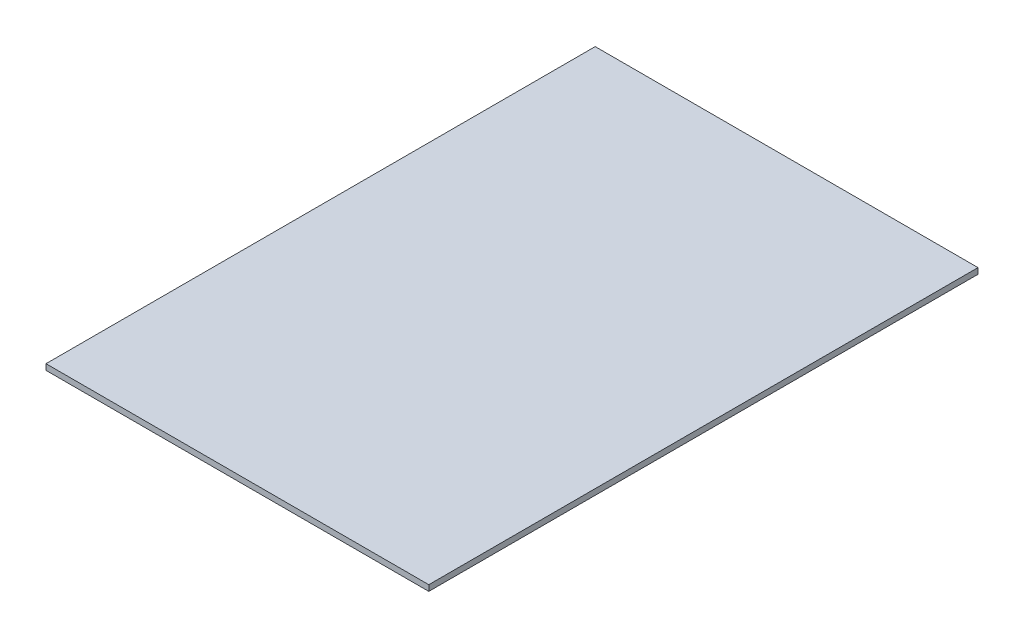
ISO-10303-21;
HEADER;
FILE_DESCRIPTION(('STEP AP214'),'2;1');
FILE_NAME('part.step','',(''),(''),'','','');
FILE_SCHEMA(('AUTOMOTIVE_DESIGN { 1 0 10303 214 1 1 1 1 }'));
ENDSEC;
DATA;
#1=APPLICATION_CONTEXT('core data for automotive mechanical design processes');
#2=APPLICATION_PROTOCOL_DEFINITION('international standard','automotive_design',2000,#1);
#3=PRODUCT_CONTEXT('',#1,'mechanical');
#4=PRODUCT('Part','Part','',(#3));
#5=PRODUCT_RELATED_PRODUCT_CATEGORY('part','',(#4));
#6=PRODUCT_DEFINITION_FORMATION('','',#4);
#7=PRODUCT_DEFINITION_CONTEXT('part definition',#1,'design');
#8=PRODUCT_DEFINITION('design','',#6,#7);
#9=PRODUCT_DEFINITION_SHAPE('','',#8);
#10=(LENGTH_UNIT() NAMED_UNIT(*) SI_UNIT(.MILLI.,.METRE.));
#11=(NAMED_UNIT(*) PLANE_ANGLE_UNIT() SI_UNIT($,.RADIAN.));
#12=(NAMED_UNIT(*) SI_UNIT($,.STERADIAN.) SOLID_ANGLE_UNIT());
#13=UNCERTAINTY_MEASURE_WITH_UNIT(LENGTH_MEASURE(1.E-05),#10,'distance_accuracy_value','');
#14=(GEOMETRIC_REPRESENTATION_CONTEXT(3) GLOBAL_UNCERTAINTY_ASSIGNED_CONTEXT((#13)) GLOBAL_UNIT_ASSIGNED_CONTEXT((#10,
#11,#12)) REPRESENTATION_CONTEXT('',''));
#15=CARTESIAN_POINT('',(0.,0.,0.));
#16=DIRECTION('',(0.,0.,1.));
#17=DIRECTION('',(1.,0.,0.));
#18=AXIS2_PLACEMENT_3D('',#15,#16,#17);
#19=CARTESIAN_POINT('',(115.,3.5,-165.));
#20=DIRECTION('',(-1.,0.,0.));
#21=DIRECTION('',(0.,0.,1.));
#22=AXIS2_PLACEMENT_3D('',#19,#20,#21);
#23=PLANE('',#22);
#24=DIRECTION('',(0.,0.,-1.));
#25=VECTOR('',#24,1.);
#26=CARTESIAN_POINT('',(115.,0.,-165.));
#27=LINE('',#26,#25);
#28=CARTESIAN_POINT('',(115.,0.,165.));
#29=VERTEX_POINT('',#28);
#30=CARTESIAN_POINT('',(115.,0.,-165.));
#31=VERTEX_POINT('',#30);
#32=EDGE_CURVE('E107',#29,#31,#27,.T.);
#33=ORIENTED_EDGE('',*,*,#32,.T.);
#34=DIRECTION('',(0.,-1.,0.));
#35=VECTOR('',#34,1.);
#36=CARTESIAN_POINT('',(115.,3.5,-165.));
#37=LINE('',#36,#35);
#38=CARTESIAN_POINT('',(115.,3.5,-165.));
#39=VERTEX_POINT('',#38);
#40=EDGE_CURVE('E11',#39,#31,#37,.T.);
#41=ORIENTED_EDGE('',*,*,#40,.F.);
#42=DIRECTION('',(0.,0.,-1.));
#43=VECTOR('',#42,1.);
#44=CARTESIAN_POINT('',(115.,3.5,-165.));
#45=LINE('',#44,#43);
#46=CARTESIAN_POINT('',(115.,3.5,165.));
#47=VERTEX_POINT('',#46);
#48=EDGE_CURVE('E91',#47,#39,#45,.T.);
#49=ORIENTED_EDGE('',*,*,#48,.F.);
#50=DIRECTION('',(0.,-1.,0.));
#51=VECTOR('',#50,1.);
#52=CARTESIAN_POINT('',(115.,3.5,165.));
#53=LINE('',#52,#51);
#54=EDGE_CURVE('E103',#47,#29,#53,.T.);
#55=ORIENTED_EDGE('',*,*,#54,.T.);
#56=EDGE_LOOP('',(#33,#41,#49,#55));
#57=FACE_BOUND('',#56,.T.);
#58=ADVANCED_FACE('F39',(#57),#23,.F.);
#59=CARTESIAN_POINT('',(-115.,3.5,-165.));
#60=DIRECTION('',(0.,0.,1.));
#61=DIRECTION('',(1.,0.,0.));
#62=AXIS2_PLACEMENT_3D('',#59,#60,#61);
#63=PLANE('',#62);
#64=DIRECTION('',(-1.,0.,0.));
#65=VECTOR('',#64,1.);
#66=CARTESIAN_POINT('',(-115.,0.,-165.));
#67=LINE('',#66,#65);
#68=CARTESIAN_POINT('',(-115.,0.,-165.));
#69=VERTEX_POINT('',#68);
#70=EDGE_CURVE('E96',#31,#69,#67,.T.);
#71=ORIENTED_EDGE('',*,*,#70,.T.);
#72=DIRECTION('',(0.,-1.,0.));
#73=VECTOR('',#72,1.);
#74=CARTESIAN_POINT('',(-115.,3.5,-165.));
#75=LINE('',#74,#73);
#76=CARTESIAN_POINT('',(-115.,3.5,-165.));
#77=VERTEX_POINT('',#76);
#78=EDGE_CURVE('E48',#77,#69,#75,.T.);
#79=ORIENTED_EDGE('',*,*,#78,.F.);
#80=DIRECTION('',(-1.,0.,0.));
#81=VECTOR('',#80,1.);
#82=CARTESIAN_POINT('',(-115.,3.5,-165.));
#83=LINE('',#82,#81);
#84=EDGE_CURVE('E86',#39,#77,#83,.T.);
#85=ORIENTED_EDGE('',*,*,#84,.F.);
#86=ORIENTED_EDGE('',*,*,#40,.T.);
#87=EDGE_LOOP('',(#71,#79,#85,#86));
#88=FACE_BOUND('',#87,.T.);
#89=ADVANCED_FACE('F95',(#88),#63,.F.);
#90=CARTESIAN_POINT('',(-115.,3.5,-165.));
#91=DIRECTION('',(1.,0.,0.));
#92=DIRECTION('',(0.,0.,-1.));
#93=AXIS2_PLACEMENT_3D('',#90,#91,#92);
#94=PLANE('',#93);
#95=DIRECTION('',(0.,0.,1.));
#96=VECTOR('',#95,1.);
#97=CARTESIAN_POINT('',(-115.,0.,-165.));
#98=LINE('',#97,#96);
#99=CARTESIAN_POINT('',(-115.,0.,165.));
#100=VERTEX_POINT('',#99);
#101=EDGE_CURVE('E73',#69,#100,#98,.T.);
#102=ORIENTED_EDGE('',*,*,#101,.T.);
#103=DIRECTION('',(0.,-1.,0.));
#104=VECTOR('',#103,1.);
#105=CARTESIAN_POINT('',(-115.,3.5,165.));
#106=LINE('',#105,#104);
#107=CARTESIAN_POINT('',(-115.,3.5,165.));
#108=VERTEX_POINT('',#107);
#109=EDGE_CURVE('E98',#108,#100,#106,.T.);
#110=ORIENTED_EDGE('',*,*,#109,.F.);
#111=DIRECTION('',(0.,0.,1.));
#112=VECTOR('',#111,1.);
#113=CARTESIAN_POINT('',(-115.,3.5,-165.));
#114=LINE('',#113,#112);
#115=EDGE_CURVE('E89',#77,#108,#114,.T.);
#116=ORIENTED_EDGE('',*,*,#115,.F.);
#117=ORIENTED_EDGE('',*,*,#78,.T.);
#118=EDGE_LOOP('',(#102,#110,#116,#117));
#119=FACE_BOUND('',#118,.T.);
#120=ADVANCED_FACE('F99',(#119),#94,.F.);
#121=CARTESIAN_POINT('',(-115.,3.5,165.));
#122=DIRECTION('',(0.,0.,-1.));
#123=DIRECTION('',(-1.,0.,0.));
#124=AXIS2_PLACEMENT_3D('',#121,#122,#123);
#125=PLANE('',#124);
#126=DIRECTION('',(1.,0.,0.));
#127=VECTOR('',#126,1.);
#128=CARTESIAN_POINT('',(-115.,0.,165.));
#129=LINE('',#128,#127);
#130=EDGE_CURVE('E79',#100,#29,#129,.T.);
#131=ORIENTED_EDGE('',*,*,#130,.T.);
#132=ORIENTED_EDGE('',*,*,#54,.F.);
#133=DIRECTION('',(1.,0.,0.));
#134=VECTOR('',#133,1.);
#135=CARTESIAN_POINT('',(-115.,3.5,165.));
#136=LINE('',#135,#134);
#137=EDGE_CURVE('E56',#108,#47,#136,.T.);
#138=ORIENTED_EDGE('',*,*,#137,.F.);
#139=ORIENTED_EDGE('',*,*,#109,.T.);
#140=EDGE_LOOP('',(#131,#132,#138,#139));
#141=FACE_BOUND('',#140,.T.);
#142=ADVANCED_FACE('F120',(#141),#125,.F.);
#143=CARTESIAN_POINT('',(0.,3.5,0.));
#144=DIRECTION('',(0.,1.,0.));
#145=DIRECTION('',(0.,0.,1.));
#146=AXIS2_PLACEMENT_3D('',#143,#144,#145);
#147=PLANE('',#146);
#148=ORIENTED_EDGE('',*,*,#48,.T.);
#149=ORIENTED_EDGE('',*,*,#84,.T.);
#150=ORIENTED_EDGE('',*,*,#115,.T.);
#151=ORIENTED_EDGE('',*,*,#137,.T.);
#152=EDGE_LOOP('',(#148,#149,#150,#151));
#153=FACE_BOUND('',#152,.T.);
#154=ADVANCED_FACE('F87',(#153),#147,.T.);
#155=CARTESIAN_POINT('',(0.,0.,0.));
#156=DIRECTION('',(0.,1.,0.));
#157=DIRECTION('',(0.,0.,1.));
#158=AXIS2_PLACEMENT_3D('',#155,#156,#157);
#159=PLANE('',#158);
#160=ORIENTED_EDGE('',*,*,#32,.F.);
#161=ORIENTED_EDGE('',*,*,#130,.F.);
#162=ORIENTED_EDGE('',*,*,#101,.F.);
#163=ORIENTED_EDGE('',*,*,#70,.F.);
#164=EDGE_LOOP('',(#160,#161,#162,#163));
#165=FACE_BOUND('',#164,.T.);
#166=ADVANCED_FACE('F123',(#165),#159,.F.);
#167=CLOSED_SHELL('',(#58,#89,#120,#142,#154,#166));
#168=MANIFOLD_SOLID_BREP('B2',#167);
#169=ADVANCED_BREP_SHAPE_REPRESENTATION('',(#18,#168),#14);
#170=SHAPE_DEFINITION_REPRESENTATION(#9,#169);
ENDSEC;
END-ISO-10303-21;
